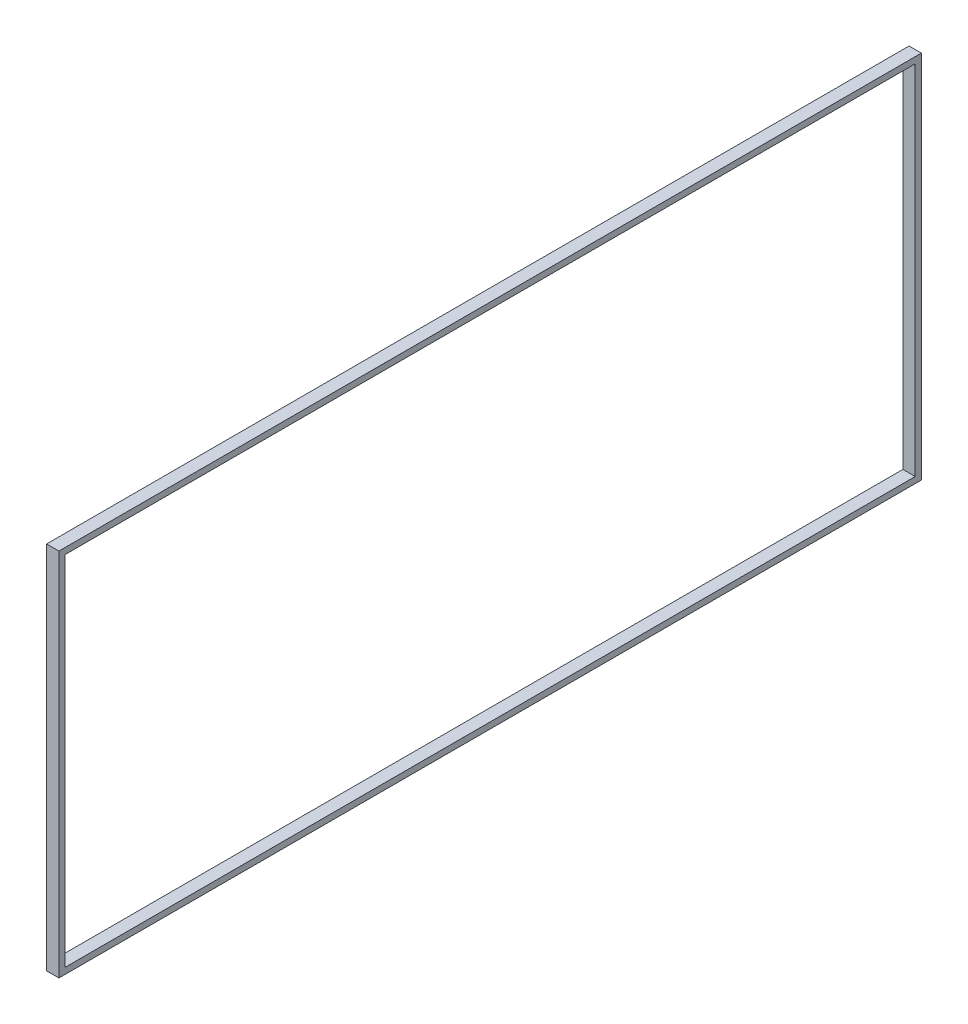
ISO-10303-21;
HEADER;
FILE_DESCRIPTION(('STEP AP214'),'2;1');
FILE_NAME('part.step','',(''),(''),'','','');
FILE_SCHEMA(('AUTOMOTIVE_DESIGN { 1 0 10303 214 1 1 1 1 }'));
ENDSEC;
DATA;
#1=APPLICATION_CONTEXT('core data for automotive mechanical design processes');
#2=APPLICATION_PROTOCOL_DEFINITION('international standard','automotive_design',2000,#1);
#3=PRODUCT_CONTEXT('',#1,'mechanical');
#4=PRODUCT('Part','Part','',(#3));
#5=PRODUCT_RELATED_PRODUCT_CATEGORY('part','',(#4));
#6=PRODUCT_DEFINITION_FORMATION('','',#4);
#7=PRODUCT_DEFINITION_CONTEXT('part definition',#1,'design');
#8=PRODUCT_DEFINITION('design','',#6,#7);
#9=PRODUCT_DEFINITION_SHAPE('','',#8);
#10=(LENGTH_UNIT() NAMED_UNIT(*) SI_UNIT(.MILLI.,.METRE.));
#11=(NAMED_UNIT(*) PLANE_ANGLE_UNIT() SI_UNIT($,.RADIAN.));
#12=(NAMED_UNIT(*) SI_UNIT($,.STERADIAN.) SOLID_ANGLE_UNIT());
#13=UNCERTAINTY_MEASURE_WITH_UNIT(LENGTH_MEASURE(1.E-05),#10,'distance_accuracy_value','');
#14=(GEOMETRIC_REPRESENTATION_CONTEXT(3) GLOBAL_UNCERTAINTY_ASSIGNED_CONTEXT((#13)) GLOBAL_UNIT_ASSIGNED_CONTEXT((#10,
#11,#12)) REPRESENTATION_CONTEXT('',''));
#15=CARTESIAN_POINT('',(0.,0.,0.));
#16=DIRECTION('',(0.,0.,1.));
#17=DIRECTION('',(1.,0.,0.));
#18=AXIS2_PLACEMENT_3D('',#15,#16,#17);
#19=CARTESIAN_POINT('',(1577.78,0.,0.));
#20=DIRECTION('',(1.,0.,0.));
#21=DIRECTION('',(0.,0.,-1.));
#22=AXIS2_PLACEMENT_3D('',#19,#20,#21);
#23=PLANE('',#22);
#24=DIRECTION('',(0.,-1.,0.));
#25=VECTOR('',#24,1.);
#26=CARTESIAN_POINT('',(1577.78,2026.91744,3628.07004659964));
#27=LINE('',#26,#25);
#28=CARTESIAN_POINT('',(1577.78,2026.91744,3628.07004659964));
#29=VERTEX_POINT('',#28);
#30=CARTESIAN_POINT('',(1577.78,-974.988164149794,3628.07004659964));
#31=VERTEX_POINT('',#30);
#32=EDGE_CURVE('E134',#29,#31,#27,.T.);
#33=ORIENTED_EDGE('',*,*,#32,.T.);
#34=DIRECTION('',(0.,0.,-1.));
#35=VECTOR('',#34,1.);
#36=CARTESIAN_POINT('',(1577.78,-974.988164149794,3628.07004659964));
#37=LINE('',#36,#35);
#38=CARTESIAN_POINT('',(1577.78,-974.988164149794,-3373.85363));
#39=VERTEX_POINT('',#38);
#40=EDGE_CURVE('E137',#31,#39,#37,.T.);
#41=ORIENTED_EDGE('',*,*,#40,.T.);
#42=DIRECTION('',(0.,1.,0.));
#43=VECTOR('',#42,1.);
#44=CARTESIAN_POINT('',(1577.78,2026.91744,-3373.85363));
#45=LINE('',#44,#43);
#46=CARTESIAN_POINT('',(1577.78,2026.91744,-3373.85363));
#47=VERTEX_POINT('',#46);
#48=EDGE_CURVE('E140',#39,#47,#45,.T.);
#49=ORIENTED_EDGE('',*,*,#48,.T.);
#50=DIRECTION('',(0.,0.,1.));
#51=VECTOR('',#50,1.);
#52=CARTESIAN_POINT('',(1577.78,2026.91744,3628.07004659964));
#53=LINE('',#52,#51);
#54=EDGE_CURVE('E142',#47,#29,#53,.T.);
#55=ORIENTED_EDGE('',*,*,#54,.T.);
#56=EDGE_LOOP('',(#33,#41,#49,#55));
#57=FACE_BOUND('',#56,.T.);
#58=DIRECTION('',(0.,0.,1.));
#59=VECTOR('',#58,1.);
#60=CARTESIAN_POINT('',(1577.78,1976.91744,-3323.85363));
#61=LINE('',#60,#59);
#62=CARTESIAN_POINT('',(1577.78,1976.91744,-3323.85363));
#63=VERTEX_POINT('',#62);
#64=CARTESIAN_POINT('',(1577.78,1976.91744,3578.07004659964));
#65=VERTEX_POINT('',#64);
#66=EDGE_CURVE('E106',#63,#65,#61,.T.);
#67=ORIENTED_EDGE('',*,*,#66,.F.);
#68=DIRECTION('',(0.,1.,0.));
#69=VECTOR('',#68,1.);
#70=CARTESIAN_POINT('',(1577.78,1976.91744,-3323.85363));
#71=LINE('',#70,#69);
#72=CARTESIAN_POINT('',(1577.78,-924.988164149794,-3323.85363));
#73=VERTEX_POINT('',#72);
#74=EDGE_CURVE('E98',#73,#63,#71,.T.);
#75=ORIENTED_EDGE('',*,*,#74,.F.);
#76=DIRECTION('',(0.,0.,-1.));
#77=VECTOR('',#76,1.);
#78=CARTESIAN_POINT('',(1577.78,-924.988164149794,-3323.85363));
#79=LINE('',#78,#77);
#80=CARTESIAN_POINT('',(1577.78,-924.988164149795,3578.07004659964));
#81=VERTEX_POINT('',#80);
#82=EDGE_CURVE('E120',#81,#73,#79,.T.);
#83=ORIENTED_EDGE('',*,*,#82,.F.);
#84=DIRECTION('',(0.,-1.,0.));
#85=VECTOR('',#84,1.);
#86=CARTESIAN_POINT('',(1577.78,1976.91744,3578.07004659964));
#87=LINE('',#86,#85);
#88=EDGE_CURVE('E118',#65,#81,#87,.T.);
#89=ORIENTED_EDGE('',*,*,#88,.F.);
#90=EDGE_LOOP('',(#67,#75,#83,#89));
#91=FACE_BOUND('',#90,.T.);
#92=ADVANCED_FACE('F33',(#57,#91),#23,.T.);
#93=CARTESIAN_POINT('',(1477.78,0.,0.));
#94=DIRECTION('',(1.,0.,0.));
#95=DIRECTION('',(0.,0.,-1.));
#96=AXIS2_PLACEMENT_3D('',#93,#94,#95);
#97=PLANE('',#96);
#98=DIRECTION('',(0.,-1.,0.));
#99=VECTOR('',#98,1.);
#100=CARTESIAN_POINT('',(1477.78,2026.91744,3628.07004659964));
#101=LINE('',#100,#99);
#102=CARTESIAN_POINT('',(1477.78,2026.91744,3628.07004659964));
#103=VERTEX_POINT('',#102);
#104=CARTESIAN_POINT('',(1477.78,-974.988164149794,3628.07004659964));
#105=VERTEX_POINT('',#104);
#106=EDGE_CURVE('E114',#103,#105,#101,.T.);
#107=ORIENTED_EDGE('',*,*,#106,.F.);
#108=DIRECTION('',(0.,0.,1.));
#109=VECTOR('',#108,1.);
#110=CARTESIAN_POINT('',(1477.78,2026.91744,3628.07004659964));
#111=LINE('',#110,#109);
#112=CARTESIAN_POINT('',(1477.78,2026.91744,-3373.85363));
#113=VERTEX_POINT('',#112);
#114=EDGE_CURVE('E138',#113,#103,#111,.T.);
#115=ORIENTED_EDGE('',*,*,#114,.F.);
#116=DIRECTION('',(0.,1.,0.));
#117=VECTOR('',#116,1.);
#118=CARTESIAN_POINT('',(1477.78,2026.91744,-3373.85363));
#119=LINE('',#118,#117);
#120=CARTESIAN_POINT('',(1477.78,-974.988164149794,-3373.85363));
#121=VERTEX_POINT('',#120);
#122=EDGE_CURVE('E149',#121,#113,#119,.T.);
#123=ORIENTED_EDGE('',*,*,#122,.F.);
#124=DIRECTION('',(0.,0.,-1.));
#125=VECTOR('',#124,1.);
#126=CARTESIAN_POINT('',(1477.78,-974.988164149794,3628.07004659964));
#127=LINE('',#126,#125);
#128=EDGE_CURVE('E147',#105,#121,#127,.T.);
#129=ORIENTED_EDGE('',*,*,#128,.F.);
#130=EDGE_LOOP('',(#107,#115,#123,#129));
#131=FACE_BOUND('',#130,.T.);
#132=DIRECTION('',(0.,1.,0.));
#133=VECTOR('',#132,1.);
#134=CARTESIAN_POINT('',(1477.78,1976.91744,-3323.85363));
#135=LINE('',#134,#133);
#136=CARTESIAN_POINT('',(1477.78,-924.988164149794,-3323.85363));
#137=VERTEX_POINT('',#136);
#138=CARTESIAN_POINT('',(1477.78,1976.91744,-3323.85363));
#139=VERTEX_POINT('',#138);
#140=EDGE_CURVE('E56',#137,#139,#135,.T.);
#141=ORIENTED_EDGE('',*,*,#140,.T.);
#142=DIRECTION('',(0.,0.,1.));
#143=VECTOR('',#142,1.);
#144=CARTESIAN_POINT('',(1477.78,1976.91744,-3323.85363));
#145=LINE('',#144,#143);
#146=CARTESIAN_POINT('',(1477.78,1976.91744,3578.07004659964));
#147=VERTEX_POINT('',#146);
#148=EDGE_CURVE('E113',#139,#147,#145,.T.);
#149=ORIENTED_EDGE('',*,*,#148,.T.);
#150=DIRECTION('',(0.,-1.,0.));
#151=VECTOR('',#150,1.);
#152=CARTESIAN_POINT('',(1477.78,1976.91744,3578.07004659964));
#153=LINE('',#152,#151);
#154=CARTESIAN_POINT('',(1477.78,-924.988164149795,3578.07004659964));
#155=VERTEX_POINT('',#154);
#156=EDGE_CURVE('E126',#147,#155,#153,.T.);
#157=ORIENTED_EDGE('',*,*,#156,.T.);
#158=DIRECTION('',(0.,0.,-1.));
#159=VECTOR('',#158,1.);
#160=CARTESIAN_POINT('',(1477.78,-924.988164149794,-3323.85363));
#161=LINE('',#160,#159);
#162=EDGE_CURVE('E107',#155,#137,#161,.T.);
#163=ORIENTED_EDGE('',*,*,#162,.T.);
#164=EDGE_LOOP('',(#141,#149,#157,#163));
#165=FACE_BOUND('',#164,.T.);
#166=ADVANCED_FACE('F167',(#131,#165),#97,.F.);
#167=CARTESIAN_POINT('',(1577.78,2026.91744,3628.07004659964));
#168=DIRECTION('',(0.,0.,-1.));
#169=DIRECTION('',(0.,1.,0.));
#170=AXIS2_PLACEMENT_3D('',#167,#168,#169);
#171=PLANE('',#170);
#172=ORIENTED_EDGE('',*,*,#106,.T.);
#173=DIRECTION('',(-1.,0.,0.));
#174=VECTOR('',#173,1.);
#175=CARTESIAN_POINT('',(1577.78,-974.988164149794,3628.07004659964));
#176=LINE('',#175,#174);
#177=EDGE_CURVE('E11',#31,#105,#176,.T.);
#178=ORIENTED_EDGE('',*,*,#177,.F.);
#179=ORIENTED_EDGE('',*,*,#32,.F.);
#180=DIRECTION('',(-1.,0.,0.));
#181=VECTOR('',#180,1.);
#182=CARTESIAN_POINT('',(1577.78,2026.91744,3628.07004659964));
#183=LINE('',#182,#181);
#184=EDGE_CURVE('E144',#29,#103,#183,.T.);
#185=ORIENTED_EDGE('',*,*,#184,.T.);
#186=EDGE_LOOP('',(#172,#178,#179,#185));
#187=FACE_BOUND('',#186,.T.);
#188=ADVANCED_FACE('F35',(#187),#171,.F.);
#189=CARTESIAN_POINT('',(1577.78,-974.988164149794,3628.07004659964));
#190=DIRECTION('',(0.,1.,0.));
#191=DIRECTION('',(0.,0.,1.));
#192=AXIS2_PLACEMENT_3D('',#189,#190,#191);
#193=PLANE('',#192);
#194=ORIENTED_EDGE('',*,*,#128,.T.);
#195=DIRECTION('',(-1.,0.,0.));
#196=VECTOR('',#195,1.);
#197=CARTESIAN_POINT('',(1577.78,-974.988164149794,-3373.85363));
#198=LINE('',#197,#196);
#199=EDGE_CURVE('E41',#39,#121,#198,.T.);
#200=ORIENTED_EDGE('',*,*,#199,.F.);
#201=ORIENTED_EDGE('',*,*,#40,.F.);
#202=ORIENTED_EDGE('',*,*,#177,.T.);
#203=EDGE_LOOP('',(#194,#200,#201,#202));
#204=FACE_BOUND('',#203,.T.);
#205=ADVANCED_FACE('F177',(#204),#193,.F.);
#206=CARTESIAN_POINT('',(1577.78,2026.91744,-3373.85363));
#207=DIRECTION('',(0.,0.,1.));
#208=DIRECTION('',(0.,-1.,0.));
#209=AXIS2_PLACEMENT_3D('',#206,#207,#208);
#210=PLANE('',#209);
#211=ORIENTED_EDGE('',*,*,#122,.T.);
#212=DIRECTION('',(-1.,0.,0.));
#213=VECTOR('',#212,1.);
#214=CARTESIAN_POINT('',(1577.78,2026.91744,-3373.85363));
#215=LINE('',#214,#213);
#216=EDGE_CURVE('E154',#47,#113,#215,.T.);
#217=ORIENTED_EDGE('',*,*,#216,.F.);
#218=ORIENTED_EDGE('',*,*,#48,.F.);
#219=ORIENTED_EDGE('',*,*,#199,.T.);
#220=EDGE_LOOP('',(#211,#217,#218,#219));
#221=FACE_BOUND('',#220,.T.);
#222=ADVANCED_FACE('F161',(#221),#210,.F.);
#223=CARTESIAN_POINT('',(1577.78,2026.91744,3628.07004659964));
#224=DIRECTION('',(0.,-1.,0.));
#225=DIRECTION('',(0.,0.,-1.));
#226=AXIS2_PLACEMENT_3D('',#223,#224,#225);
#227=PLANE('',#226);
#228=ORIENTED_EDGE('',*,*,#114,.T.);
#229=ORIENTED_EDGE('',*,*,#184,.F.);
#230=ORIENTED_EDGE('',*,*,#54,.F.);
#231=ORIENTED_EDGE('',*,*,#216,.T.);
#232=EDGE_LOOP('',(#228,#229,#230,#231));
#233=FACE_BOUND('',#232,.T.);
#234=ADVANCED_FACE('F171',(#233),#227,.F.);
#235=CARTESIAN_POINT('',(1577.78,1976.91744,-3323.85363));
#236=DIRECTION('',(0.,0.,1.));
#237=DIRECTION('',(0.,-1.,0.));
#238=AXIS2_PLACEMENT_3D('',#235,#236,#237);
#239=PLANE('',#238);
#240=ORIENTED_EDGE('',*,*,#140,.F.);
#241=DIRECTION('',(-1.,0.,0.));
#242=VECTOR('',#241,1.);
#243=CARTESIAN_POINT('',(1577.78,-924.988164149794,-3323.85363));
#244=LINE('',#243,#242);
#245=EDGE_CURVE('E102',#73,#137,#244,.T.);
#246=ORIENTED_EDGE('',*,*,#245,.F.);
#247=ORIENTED_EDGE('',*,*,#74,.T.);
#248=DIRECTION('',(-1.,0.,0.));
#249=VECTOR('',#248,1.);
#250=CARTESIAN_POINT('',(1577.78,1976.91744,-3323.85363));
#251=LINE('',#250,#249);
#252=EDGE_CURVE('E101',#63,#139,#251,.T.);
#253=ORIENTED_EDGE('',*,*,#252,.T.);
#254=EDGE_LOOP('',(#240,#246,#247,#253));
#255=FACE_BOUND('',#254,.T.);
#256=ADVANCED_FACE('F100',(#255),#239,.T.);
#257=CARTESIAN_POINT('',(1577.78,1976.91744,-3323.85363));
#258=DIRECTION('',(0.,-1.,0.));
#259=DIRECTION('',(0.,0.,-1.));
#260=AXIS2_PLACEMENT_3D('',#257,#258,#259);
#261=PLANE('',#260);
#262=ORIENTED_EDGE('',*,*,#148,.F.);
#263=ORIENTED_EDGE('',*,*,#252,.F.);
#264=ORIENTED_EDGE('',*,*,#66,.T.);
#265=DIRECTION('',(-1.,0.,0.));
#266=VECTOR('',#265,1.);
#267=CARTESIAN_POINT('',(1577.78,1976.91744,3578.07004659964));
#268=LINE('',#267,#266);
#269=EDGE_CURVE('E115',#65,#147,#268,.T.);
#270=ORIENTED_EDGE('',*,*,#269,.T.);
#271=EDGE_LOOP('',(#262,#263,#264,#270));
#272=FACE_BOUND('',#271,.T.);
#273=ADVANCED_FACE('F110',(#272),#261,.T.);
#274=CARTESIAN_POINT('',(1577.78,1976.91744,3578.07004659964));
#275=DIRECTION('',(0.,0.,-1.));
#276=DIRECTION('',(-1.,0.,0.));
#277=AXIS2_PLACEMENT_3D('',#274,#275,#276);
#278=PLANE('',#277);
#279=ORIENTED_EDGE('',*,*,#156,.F.);
#280=ORIENTED_EDGE('',*,*,#269,.F.);
#281=ORIENTED_EDGE('',*,*,#88,.T.);
#282=DIRECTION('',(-1.,0.,0.));
#283=VECTOR('',#282,1.);
#284=CARTESIAN_POINT('',(1577.78,-924.988164149795,3578.07004659964));
#285=LINE('',#284,#283);
#286=EDGE_CURVE('E48',#81,#155,#285,.T.);
#287=ORIENTED_EDGE('',*,*,#286,.T.);
#288=EDGE_LOOP('',(#279,#280,#281,#287));
#289=FACE_BOUND('',#288,.T.);
#290=ADVANCED_FACE('F200',(#289),#278,.T.);
#291=CARTESIAN_POINT('',(1577.78,-924.988164149794,-3323.85363));
#292=DIRECTION('',(0.,1.,0.));
#293=DIRECTION('',(0.,0.,1.));
#294=AXIS2_PLACEMENT_3D('',#291,#292,#293);
#295=PLANE('',#294);
#296=ORIENTED_EDGE('',*,*,#162,.F.);
#297=ORIENTED_EDGE('',*,*,#286,.F.);
#298=ORIENTED_EDGE('',*,*,#82,.T.);
#299=ORIENTED_EDGE('',*,*,#245,.T.);
#300=EDGE_LOOP('',(#296,#297,#298,#299));
#301=FACE_BOUND('',#300,.T.);
#302=ADVANCED_FACE('F204',(#301),#295,.T.);
#303=CLOSED_SHELL('',(#92,#166,#188,#205,#222,#234,#256,#273,#290,#302));
#304=MANIFOLD_SOLID_BREP('B2',#303);
#305=ADVANCED_BREP_SHAPE_REPRESENTATION('',(#18,#304),#14);
#306=SHAPE_DEFINITION_REPRESENTATION(#9,#305);
ENDSEC;
END-ISO-10303-21;
